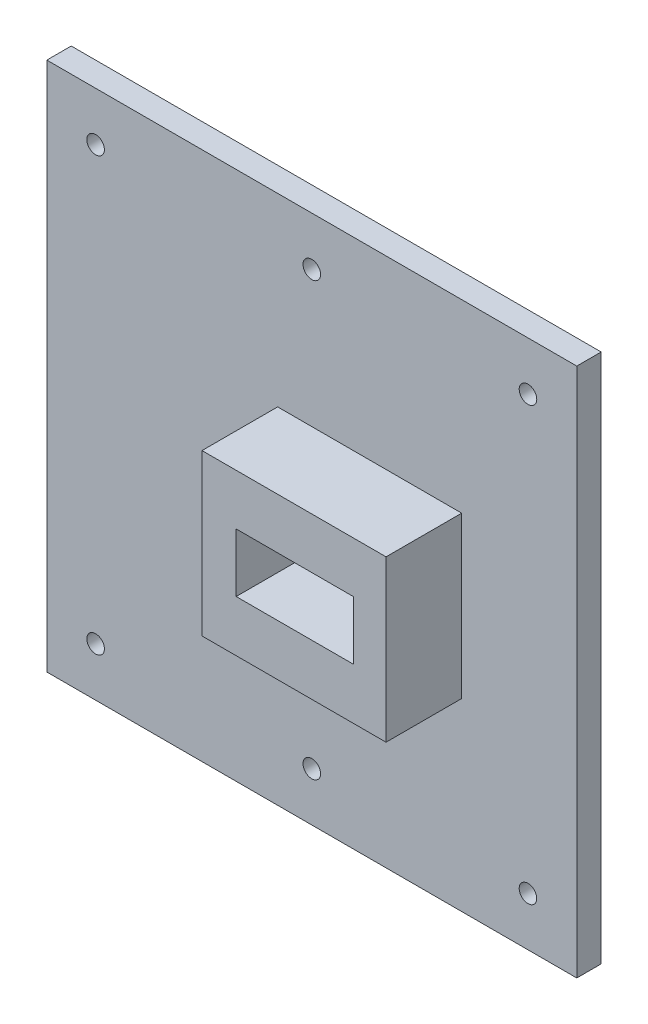
ISO-10303-21;
HEADER;
FILE_DESCRIPTION(('STEP AP214'),'2;1');
FILE_NAME('part.step','',(''),(''),'','','');
FILE_SCHEMA(('AUTOMOTIVE_DESIGN { 1 0 10303 214 1 1 1 1 }'));
ENDSEC;
DATA;
#1=APPLICATION_CONTEXT('core data for automotive mechanical design processes');
#2=APPLICATION_PROTOCOL_DEFINITION('international standard','automotive_design',2000,#1);
#3=PRODUCT_CONTEXT('',#1,'mechanical');
#4=PRODUCT('Part','Part','',(#3));
#5=PRODUCT_RELATED_PRODUCT_CATEGORY('part','',(#4));
#6=PRODUCT_DEFINITION_FORMATION('','',#4);
#7=PRODUCT_DEFINITION_CONTEXT('part definition',#1,'design');
#8=PRODUCT_DEFINITION('design','',#6,#7);
#9=PRODUCT_DEFINITION_SHAPE('','',#8);
#10=(LENGTH_UNIT() NAMED_UNIT(*) SI_UNIT(.MILLI.,.METRE.));
#11=(NAMED_UNIT(*) PLANE_ANGLE_UNIT() SI_UNIT($,.RADIAN.));
#12=(NAMED_UNIT(*) SI_UNIT($,.STERADIAN.) SOLID_ANGLE_UNIT());
#13=UNCERTAINTY_MEASURE_WITH_UNIT(LENGTH_MEASURE(1.E-05),#10,'distance_accuracy_value','');
#14=(GEOMETRIC_REPRESENTATION_CONTEXT(3) GLOBAL_UNCERTAINTY_ASSIGNED_CONTEXT((#13)) GLOBAL_UNIT_ASSIGNED_CONTEXT((#10,
#11,#12)) REPRESENTATION_CONTEXT('',''));
#15=CARTESIAN_POINT('',(0.,0.,0.));
#16=DIRECTION('',(0.,0.,1.));
#17=DIRECTION('',(1.,0.,0.));
#18=AXIS2_PLACEMENT_3D('',#15,#16,#17);
#19=CARTESIAN_POINT('',(0.,0.,5.));
#20=DIRECTION('',(0.,0.,1.));
#21=DIRECTION('',(1.,0.,0.));
#22=AXIS2_PLACEMENT_3D('',#19,#20,#21);
#23=PLANE('',#22);
#24=DIRECTION('',(0.,1.,0.));
#25=VECTOR('',#24,1.);
#26=CARTESIAN_POINT('',(11.7655451483791,0.,5.));
#27=LINE('',#26,#25);
#28=CARTESIAN_POINT('',(11.7655451483791,-131.477817804765,5.));
#29=VERTEX_POINT('',#28);
#30=CARTESIAN_POINT('',(11.7655451483791,-22.8878178047649,5.));
#31=VERTEX_POINT('',#30);
#32=EDGE_CURVE('E210',#29,#31,#27,.T.);
#33=ORIENTED_EDGE('',*,*,#32,.T.);
#34=DIRECTION('',(-1.,0.,0.));
#35=VECTOR('',#34,1.);
#36=CARTESIAN_POINT('',(0.,-22.8878178047649,5.));
#37=LINE('',#36,#35);
#38=CARTESIAN_POINT('',(-96.8244548516209,-22.8878178047649,5.));
#39=VERTEX_POINT('',#38);
#40=EDGE_CURVE('E213',#31,#39,#37,.T.);
#41=ORIENTED_EDGE('',*,*,#40,.T.);
#42=DIRECTION('',(0.,1.,0.));
#43=VECTOR('',#42,1.);
#44=CARTESIAN_POINT('',(-96.8244548516209,0.,5.));
#45=LINE('',#44,#43);
#46=CARTESIAN_POINT('',(-96.8244548516209,-131.477817804765,5.));
#47=VERTEX_POINT('',#46);
#48=EDGE_CURVE('E215',#47,#39,#45,.T.);
#49=ORIENTED_EDGE('',*,*,#48,.F.);
#50=DIRECTION('',(-1.,0.,0.));
#51=VECTOR('',#50,1.);
#52=CARTESIAN_POINT('',(0.,-131.477817804765,5.));
#53=LINE('',#52,#51);
#54=EDGE_CURVE('E218',#29,#47,#53,.T.);
#55=ORIENTED_EDGE('',*,*,#54,.F.);
#56=EDGE_LOOP('',(#33,#41,#49,#55));
#57=FACE_BOUND('',#56,.T.);
#58=CARTESIAN_POINT('',(1.76554514837908,-32.8878178047649,5.));
#59=DIRECTION('',(0.,0.,1.));
#60=DIRECTION('',(1.,0.,0.));
#61=AXIS2_PLACEMENT_3D('',#58,#59,#60);
#62=CIRCLE('',#61,1.8);
#63=CARTESIAN_POINT('',(3.56554514837908,-32.8878178047649,5.));
#64=VERTEX_POINT('',#63);
#65=EDGE_CURVE('E207',#64,#64,#62,.T.);
#66=ORIENTED_EDGE('',*,*,#65,.F.);
#67=EDGE_LOOP('',(#66));
#68=FACE_BOUND('',#67,.T.);
#69=CARTESIAN_POINT('',(1.76554514837908,-121.477817804765,5.));
#70=DIRECTION('',(0.,0.,1.));
#71=DIRECTION('',(1.,0.,0.));
#72=AXIS2_PLACEMENT_3D('',#69,#70,#71);
#73=CIRCLE('',#72,1.8);
#74=CARTESIAN_POINT('',(3.56554514837908,-121.477817804765,5.));
#75=VERTEX_POINT('',#74);
#76=EDGE_CURVE('E204',#75,#75,#73,.T.);
#77=ORIENTED_EDGE('',*,*,#76,.F.);
#78=EDGE_LOOP('',(#77));
#79=FACE_BOUND('',#78,.T.);
#80=CARTESIAN_POINT('',(-86.8244548516209,-121.477817804765,5.));
#81=DIRECTION('',(0.,0.,1.));
#82=DIRECTION('',(1.,0.,0.));
#83=AXIS2_PLACEMENT_3D('',#80,#81,#82);
#84=CIRCLE('',#83,1.79999999999999);
#85=CARTESIAN_POINT('',(-85.0244548516209,-121.477817804765,5.));
#86=VERTEX_POINT('',#85);
#87=EDGE_CURVE('E201',#86,#86,#84,.T.);
#88=ORIENTED_EDGE('',*,*,#87,.F.);
#89=EDGE_LOOP('',(#88));
#90=FACE_BOUND('',#89,.T.);
#91=CARTESIAN_POINT('',(-86.8244548516209,-32.8878178047649,5.));
#92=DIRECTION('',(0.,0.,1.));
#93=DIRECTION('',(1.,0.,0.));
#94=AXIS2_PLACEMENT_3D('',#91,#92,#93);
#95=CIRCLE('',#94,1.79999999999999);
#96=CARTESIAN_POINT('',(-85.0244548516209,-32.8878178047649,5.));
#97=VERTEX_POINT('',#96);
#98=EDGE_CURVE('E198',#97,#97,#95,.T.);
#99=ORIENTED_EDGE('',*,*,#98,.F.);
#100=EDGE_LOOP('',(#99));
#101=FACE_BOUND('',#100,.T.);
#102=CARTESIAN_POINT('',(-42.5294548516209,-32.8878178047649,5.));
#103=DIRECTION('',(0.,0.,1.));
#104=DIRECTION('',(1.,0.,0.));
#105=AXIS2_PLACEMENT_3D('',#102,#103,#104);
#106=CIRCLE('',#105,1.8);
#107=CARTESIAN_POINT('',(-40.7294548516209,-32.8878178047649,5.));
#108=VERTEX_POINT('',#107);
#109=EDGE_CURVE('E194',#108,#108,#106,.T.);
#110=ORIENTED_EDGE('',*,*,#109,.F.);
#111=EDGE_LOOP('',(#110));
#112=FACE_BOUND('',#111,.T.);
#113=CARTESIAN_POINT('',(-42.5294548516209,-121.477817804765,5.));
#114=DIRECTION('',(0.,0.,1.));
#115=DIRECTION('',(1.,0.,0.));
#116=AXIS2_PLACEMENT_3D('',#113,#114,#115);
#117=CIRCLE('',#116,1.8);
#118=CARTESIAN_POINT('',(-40.7294548516209,-121.477817804765,5.));
#119=VERTEX_POINT('',#118);
#120=EDGE_CURVE('E191',#119,#119,#117,.T.);
#121=ORIENTED_EDGE('',*,*,#120,.F.);
#122=EDGE_LOOP('',(#121));
#123=FACE_BOUND('',#122,.T.);
#124=DIRECTION('',(0.,1.,0.));
#125=VECTOR('',#124,1.);
#126=CARTESIAN_POINT('',(-11.8172544043155,-93.6790827296241,5.));
#127=LINE('',#126,#125);
#128=CARTESIAN_POINT('',(-11.8172544043155,-93.6790827296241,5.));
#129=VERTEX_POINT('',#128);
#130=CARTESIAN_POINT('',(-11.8172544043155,-60.7803795546279,5.));
#131=VERTEX_POINT('',#130);
#132=EDGE_CURVE('E177',#129,#131,#127,.T.);
#133=ORIENTED_EDGE('',*,*,#132,.F.);
#134=DIRECTION('',(1.,0.,0.));
#135=VECTOR('',#134,1.);
#136=CARTESIAN_POINT('',(-49.5294548516209,-93.6790827296241,5.));
#137=LINE('',#136,#135);
#138=CARTESIAN_POINT('',(-49.5294548516209,-93.6790827296241,5.));
#139=VERTEX_POINT('',#138);
#140=EDGE_CURVE('E142',#139,#129,#137,.T.);
#141=ORIENTED_EDGE('',*,*,#140,.F.);
#142=DIRECTION('',(0.,-1.,0.));
#143=VECTOR('',#142,1.);
#144=CARTESIAN_POINT('',(-49.5294548516209,-93.6790827296241,5.));
#145=LINE('',#144,#143);
#146=CARTESIAN_POINT('',(-49.5294548516209,-60.7803795546279,5.));
#147=VERTEX_POINT('',#146);
#148=EDGE_CURVE('E168',#147,#139,#145,.T.);
#149=ORIENTED_EDGE('',*,*,#148,.F.);
#150=DIRECTION('',(-1.,0.,0.));
#151=VECTOR('',#150,1.);
#152=CARTESIAN_POINT('',(-49.5294548516209,-60.7803795546279,5.));
#153=LINE('',#152,#151);
#154=EDGE_CURVE('E179',#131,#147,#153,.T.);
#155=ORIENTED_EDGE('',*,*,#154,.F.);
#156=EDGE_LOOP('',(#133,#141,#149,#155));
#157=FACE_BOUND('',#156,.T.);
#158=ADVANCED_FACE('F35',(#57,#68,#79,#90,#101,#112,#123,#157),#23,.T.);
#159=CARTESIAN_POINT('',(11.7655451483791,0.,5.));
#160=DIRECTION('',(-1.,0.,0.));
#161=DIRECTION('',(0.,0.,1.));
#162=AXIS2_PLACEMENT_3D('',#159,#160,#161);
#163=PLANE('',#162);
#164=DIRECTION('',(0.,1.,0.));
#165=VECTOR('',#164,1.);
#166=CARTESIAN_POINT('',(11.7655451483791,0.,0.));
#167=LINE('',#166,#165);
#168=CARTESIAN_POINT('',(11.7655451483791,-131.477817804765,0.));
#169=VERTEX_POINT('',#168);
#170=CARTESIAN_POINT('',(11.7655451483791,-22.8878178047649,0.));
#171=VERTEX_POINT('',#170);
#172=EDGE_CURVE('E239',#169,#171,#167,.T.);
#173=ORIENTED_EDGE('',*,*,#172,.T.);
#174=DIRECTION('',(0.,0.,-1.));
#175=VECTOR('',#174,1.);
#176=CARTESIAN_POINT('',(11.7655451483791,-22.8878178047649,5.));
#177=LINE('',#176,#175);
#178=EDGE_CURVE('E11',#31,#171,#177,.T.);
#179=ORIENTED_EDGE('',*,*,#178,.F.);
#180=ORIENTED_EDGE('',*,*,#32,.F.);
#181=DIRECTION('',(0.,0.,-1.));
#182=VECTOR('',#181,1.);
#183=CARTESIAN_POINT('',(11.7655451483791,-131.477817804765,5.));
#184=LINE('',#183,#182);
#185=EDGE_CURVE('E221',#29,#169,#184,.T.);
#186=ORIENTED_EDGE('',*,*,#185,.T.);
#187=EDGE_LOOP('',(#173,#179,#180,#186));
#188=FACE_BOUND('',#187,.T.);
#189=ADVANCED_FACE('F271',(#188),#163,.F.);
#190=CARTESIAN_POINT('',(0.,-22.8878178047649,5.));
#191=DIRECTION('',(0.,-1.,0.));
#192=DIRECTION('',(1.,0.,0.));
#193=AXIS2_PLACEMENT_3D('',#190,#191,#192);
#194=PLANE('',#193);
#195=DIRECTION('',(-1.,0.,0.));
#196=VECTOR('',#195,1.);
#197=CARTESIAN_POINT('',(0.,-22.8878178047649,0.));
#198=LINE('',#197,#196);
#199=CARTESIAN_POINT('',(-96.8244548516209,-22.8878178047649,0.));
#200=VERTEX_POINT('',#199);
#201=EDGE_CURVE('E242',#171,#200,#198,.T.);
#202=ORIENTED_EDGE('',*,*,#201,.T.);
#203=DIRECTION('',(0.,0.,-1.));
#204=VECTOR('',#203,1.);
#205=CARTESIAN_POINT('',(-96.8244548516209,-22.8878178047649,5.));
#206=LINE('',#205,#204);
#207=EDGE_CURVE('E43',#39,#200,#206,.T.);
#208=ORIENTED_EDGE('',*,*,#207,.F.);
#209=ORIENTED_EDGE('',*,*,#40,.F.);
#210=ORIENTED_EDGE('',*,*,#178,.T.);
#211=EDGE_LOOP('',(#202,#208,#209,#210));
#212=FACE_BOUND('',#211,.T.);
#213=ADVANCED_FACE('F258',(#212),#194,.F.);
#214=CARTESIAN_POINT('',(-96.8244548516209,0.,5.));
#215=DIRECTION('',(-1.,0.,0.));
#216=DIRECTION('',(0.,-1.,0.));
#217=AXIS2_PLACEMENT_3D('',#214,#215,#216);
#218=PLANE('',#217);
#219=DIRECTION('',(0.,1.,0.));
#220=VECTOR('',#219,1.);
#221=CARTESIAN_POINT('',(-96.8244548516209,0.,0.));
#222=LINE('',#221,#220);
#223=CARTESIAN_POINT('',(-96.8244548516209,-131.477817804765,0.));
#224=VERTEX_POINT('',#223);
#225=EDGE_CURVE('E245',#224,#200,#222,.T.);
#226=ORIENTED_EDGE('',*,*,#225,.F.);
#227=DIRECTION('',(0.,0.,-1.));
#228=VECTOR('',#227,1.);
#229=CARTESIAN_POINT('',(-96.8244548516209,-131.477817804765,5.));
#230=LINE('',#229,#228);
#231=EDGE_CURVE('E251',#47,#224,#230,.T.);
#232=ORIENTED_EDGE('',*,*,#231,.F.);
#233=ORIENTED_EDGE('',*,*,#48,.T.);
#234=ORIENTED_EDGE('',*,*,#207,.T.);
#235=EDGE_LOOP('',(#226,#232,#233,#234));
#236=FACE_BOUND('',#235,.T.);
#237=ADVANCED_FACE('F255',(#236),#218,.T.);
#238=CARTESIAN_POINT('',(1.76554514837908,-32.8878178047649,5.));
#239=DIRECTION('',(0.,0.,-1.));
#240=DIRECTION('',(-1.,0.,0.));
#241=AXIS2_PLACEMENT_3D('',#238,#239,#240);
#242=CYLINDRICAL_SURFACE('',#241,1.8);
#243=ORIENTED_EDGE('',*,*,#65,.T.);
#244=EDGE_LOOP('',(#243));
#245=FACE_BOUND('',#244,.T.);
#246=CARTESIAN_POINT('',(1.76554514837908,-32.8878178047649,0.));
#247=DIRECTION('',(0.,0.,1.));
#248=DIRECTION('',(1.,0.,0.));
#249=AXIS2_PLACEMENT_3D('',#246,#247,#248);
#250=CIRCLE('',#249,1.8);
#251=CARTESIAN_POINT('',(3.56554514837908,-32.8878178047649,0.));
#252=VERTEX_POINT('',#251);
#253=EDGE_CURVE('E236',#252,#252,#250,.T.);
#254=ORIENTED_EDGE('',*,*,#253,.F.);
#255=EDGE_LOOP('',(#254));
#256=FACE_BOUND('',#255,.T.);
#257=ADVANCED_FACE('F283',(#245,#256),#242,.F.);
#258=CARTESIAN_POINT('',(1.76554514837908,-121.477817804765,5.));
#259=DIRECTION('',(0.,0.,-1.));
#260=DIRECTION('',(-1.,0.,0.));
#261=AXIS2_PLACEMENT_3D('',#258,#259,#260);
#262=CYLINDRICAL_SURFACE('',#261,1.8);
#263=ORIENTED_EDGE('',*,*,#76,.T.);
#264=EDGE_LOOP('',(#263));
#265=FACE_BOUND('',#264,.T.);
#266=CARTESIAN_POINT('',(1.76554514837908,-121.477817804765,0.));
#267=DIRECTION('',(0.,0.,1.));
#268=DIRECTION('',(1.,0.,0.));
#269=AXIS2_PLACEMENT_3D('',#266,#267,#268);
#270=CIRCLE('',#269,1.8);
#271=CARTESIAN_POINT('',(3.56554514837908,-121.477817804765,0.));
#272=VERTEX_POINT('',#271);
#273=EDGE_CURVE('E233',#272,#272,#270,.T.);
#274=ORIENTED_EDGE('',*,*,#273,.F.);
#275=EDGE_LOOP('',(#274));
#276=FACE_BOUND('',#275,.T.);
#277=ADVANCED_FACE('F286',(#265,#276),#262,.F.);
#278=CARTESIAN_POINT('',(-86.8244548516209,-121.477817804765,5.));
#279=DIRECTION('',(0.,0.,-1.));
#280=DIRECTION('',(-1.,0.,0.));
#281=AXIS2_PLACEMENT_3D('',#278,#279,#280);
#282=CYLINDRICAL_SURFACE('',#281,1.79999999999999);
#283=ORIENTED_EDGE('',*,*,#87,.T.);
#284=EDGE_LOOP('',(#283));
#285=FACE_BOUND('',#284,.T.);
#286=CARTESIAN_POINT('',(-86.8244548516209,-121.477817804765,0.));
#287=DIRECTION('',(0.,0.,1.));
#288=DIRECTION('',(1.,0.,0.));
#289=AXIS2_PLACEMENT_3D('',#286,#287,#288);
#290=CIRCLE('',#289,1.79999999999999);
#291=CARTESIAN_POINT('',(-85.0244548516209,-121.477817804765,0.));
#292=VERTEX_POINT('',#291);
#293=EDGE_CURVE('E230',#292,#292,#290,.T.);
#294=ORIENTED_EDGE('',*,*,#293,.F.);
#295=EDGE_LOOP('',(#294));
#296=FACE_BOUND('',#295,.T.);
#297=ADVANCED_FACE('F290',(#285,#296),#282,.F.);
#298=CARTESIAN_POINT('',(-86.8244548516209,-32.8878178047649,5.));
#299=DIRECTION('',(0.,0.,-1.));
#300=DIRECTION('',(-1.,0.,0.));
#301=AXIS2_PLACEMENT_3D('',#298,#299,#300);
#302=CYLINDRICAL_SURFACE('',#301,1.79999999999999);
#303=ORIENTED_EDGE('',*,*,#98,.T.);
#304=EDGE_LOOP('',(#303));
#305=FACE_BOUND('',#304,.T.);
#306=CARTESIAN_POINT('',(-86.8244548516209,-32.8878178047649,0.));
#307=DIRECTION('',(0.,0.,1.));
#308=DIRECTION('',(1.,0.,0.));
#309=AXIS2_PLACEMENT_3D('',#306,#307,#308);
#310=CIRCLE('',#309,1.79999999999999);
#311=CARTESIAN_POINT('',(-85.0244548516209,-32.8878178047649,0.));
#312=VERTEX_POINT('',#311);
#313=EDGE_CURVE('E227',#312,#312,#310,.T.);
#314=ORIENTED_EDGE('',*,*,#313,.F.);
#315=EDGE_LOOP('',(#314));
#316=FACE_BOUND('',#315,.T.);
#317=ADVANCED_FACE('F294',(#305,#316),#302,.F.);
#318=CARTESIAN_POINT('',(-42.5294548516209,-32.8878178047649,5.));
#319=DIRECTION('',(0.,0.,-1.));
#320=DIRECTION('',(-1.,0.,0.));
#321=AXIS2_PLACEMENT_3D('',#318,#319,#320);
#322=CYLINDRICAL_SURFACE('',#321,1.8);
#323=ORIENTED_EDGE('',*,*,#109,.T.);
#324=EDGE_LOOP('',(#323));
#325=FACE_BOUND('',#324,.T.);
#326=CARTESIAN_POINT('',(-42.5294548516209,-32.8878178047649,0.));
#327=DIRECTION('',(0.,0.,1.));
#328=DIRECTION('',(1.,0.,0.));
#329=AXIS2_PLACEMENT_3D('',#326,#327,#328);
#330=CIRCLE('',#329,1.8);
#331=CARTESIAN_POINT('',(-40.7294548516209,-32.8878178047649,0.));
#332=VERTEX_POINT('',#331);
#333=EDGE_CURVE('E224',#332,#332,#330,.T.);
#334=ORIENTED_EDGE('',*,*,#333,.F.);
#335=EDGE_LOOP('',(#334));
#336=FACE_BOUND('',#335,.T.);
#337=ADVANCED_FACE('F297',(#325,#336),#322,.F.);
#338=CARTESIAN_POINT('',(-42.5294548516209,-121.477817804765,5.));
#339=DIRECTION('',(0.,0.,-1.));
#340=DIRECTION('',(-1.,0.,0.));
#341=AXIS2_PLACEMENT_3D('',#338,#339,#340);
#342=CYLINDRICAL_SURFACE('',#341,1.8);
#343=ORIENTED_EDGE('',*,*,#120,.T.);
#344=EDGE_LOOP('',(#343));
#345=FACE_BOUND('',#344,.T.);
#346=CARTESIAN_POINT('',(-42.5294548516209,-121.477817804765,0.));
#347=DIRECTION('',(0.,0.,1.));
#348=DIRECTION('',(1.,0.,0.));
#349=AXIS2_PLACEMENT_3D('',#346,#347,#348);
#350=CIRCLE('',#349,1.8);
#351=CARTESIAN_POINT('',(-40.7294548516209,-121.477817804765,0.));
#352=VERTEX_POINT('',#351);
#353=EDGE_CURVE('E190',#352,#352,#350,.T.);
#354=ORIENTED_EDGE('',*,*,#353,.F.);
#355=EDGE_LOOP('',(#354));
#356=FACE_BOUND('',#355,.T.);
#357=ADVANCED_FACE('F37',(#345,#356),#342,.F.);
#358=CARTESIAN_POINT('',(0.,-131.477817804765,5.));
#359=DIRECTION('',(0.,-1.,0.));
#360=DIRECTION('',(0.,0.,-1.));
#361=AXIS2_PLACEMENT_3D('',#358,#359,#360);
#362=PLANE('',#361);
#363=DIRECTION('',(-1.,0.,0.));
#364=VECTOR('',#363,1.);
#365=CARTESIAN_POINT('',(0.,-131.477817804765,0.));
#366=LINE('',#365,#364);
#367=EDGE_CURVE('E195',#169,#224,#366,.T.);
#368=ORIENTED_EDGE('',*,*,#367,.F.);
#369=ORIENTED_EDGE('',*,*,#185,.F.);
#370=ORIENTED_EDGE('',*,*,#54,.T.);
#371=ORIENTED_EDGE('',*,*,#231,.T.);
#372=EDGE_LOOP('',(#368,#369,#370,#371));
#373=FACE_BOUND('',#372,.T.);
#374=ADVANCED_FACE('F265',(#373),#362,.T.);
#375=CARTESIAN_POINT('',(0.,0.,0.));
#376=DIRECTION('',(0.,0.,1.));
#377=DIRECTION('',(1.,0.,0.));
#378=AXIS2_PLACEMENT_3D('',#375,#376,#377);
#379=PLANE('',#378);
#380=ORIENTED_EDGE('',*,*,#353,.T.);
#381=EDGE_LOOP('',(#380));
#382=FACE_BOUND('',#381,.T.);
#383=ORIENTED_EDGE('',*,*,#333,.T.);
#384=EDGE_LOOP('',(#383));
#385=FACE_BOUND('',#384,.T.);
#386=ORIENTED_EDGE('',*,*,#313,.T.);
#387=EDGE_LOOP('',(#386));
#388=FACE_BOUND('',#387,.T.);
#389=ORIENTED_EDGE('',*,*,#293,.T.);
#390=EDGE_LOOP('',(#389));
#391=FACE_BOUND('',#390,.T.);
#392=ORIENTED_EDGE('',*,*,#273,.T.);
#393=EDGE_LOOP('',(#392));
#394=FACE_BOUND('',#393,.T.);
#395=ORIENTED_EDGE('',*,*,#253,.T.);
#396=EDGE_LOOP('',(#395));
#397=FACE_BOUND('',#396,.T.);
#398=ORIENTED_EDGE('',*,*,#172,.F.);
#399=ORIENTED_EDGE('',*,*,#367,.T.);
#400=ORIENTED_EDGE('',*,*,#225,.T.);
#401=ORIENTED_EDGE('',*,*,#201,.F.);
#402=EDGE_LOOP('',(#398,#399,#400,#401));
#403=FACE_BOUND('',#402,.T.);
#404=ADVANCED_FACE('F262',(#382,#385,#388,#391,#394,#397,#403),#379,.F.);
#405=CARTESIAN_POINT('',(0.,0.,20.5));
#406=DIRECTION('',(0.,0.,1.));
#407=DIRECTION('',(1.,0.,0.));
#408=AXIS2_PLACEMENT_3D('',#405,#406,#407);
#409=PLANE('',#408);
#410=DIRECTION('',(1.,0.,0.));
#411=VECTOR('',#410,1.);
#412=CARTESIAN_POINT('',(-49.5294548516209,-93.6790827296241,20.5));
#413=LINE('',#412,#411);
#414=CARTESIAN_POINT('',(-49.5294548516209,-93.6790827296241,20.5));
#415=VERTEX_POINT('',#414);
#416=CARTESIAN_POINT('',(-11.8172544043155,-93.6790827296241,20.5));
#417=VERTEX_POINT('',#416);
#418=EDGE_CURVE('E164',#415,#417,#413,.T.);
#419=ORIENTED_EDGE('',*,*,#418,.T.);
#420=DIRECTION('',(0.,1.,0.));
#421=VECTOR('',#420,1.);
#422=CARTESIAN_POINT('',(-11.8172544043155,-93.6790827296241,20.5));
#423=LINE('',#422,#421);
#424=CARTESIAN_POINT('',(-11.8172544043155,-60.7803795546279,20.5));
#425=VERTEX_POINT('',#424);
#426=EDGE_CURVE('E167',#417,#425,#423,.T.);
#427=ORIENTED_EDGE('',*,*,#426,.T.);
#428=DIRECTION('',(-1.,0.,0.));
#429=VECTOR('',#428,1.);
#430=CARTESIAN_POINT('',(-49.5294548516209,-60.7803795546279,20.5));
#431=LINE('',#430,#429);
#432=CARTESIAN_POINT('',(-49.5294548516209,-60.7803795546279,20.5));
#433=VERTEX_POINT('',#432);
#434=EDGE_CURVE('E170',#425,#433,#431,.T.);
#435=ORIENTED_EDGE('',*,*,#434,.T.);
#436=DIRECTION('',(0.,-1.,0.));
#437=VECTOR('',#436,1.);
#438=CARTESIAN_POINT('',(-49.5294548516209,-93.6790827296241,20.5));
#439=LINE('',#438,#437);
#440=EDGE_CURVE('E172',#433,#415,#439,.T.);
#441=ORIENTED_EDGE('',*,*,#440,.T.);
#442=EDGE_LOOP('',(#419,#427,#435,#441));
#443=FACE_BOUND('',#442,.T.);
#444=DIRECTION('',(0.,1.,0.));
#445=VECTOR('',#444,1.);
#446=CARTESIAN_POINT('',(-18.5294548516209,-83.1828178047649,20.5));
#447=LINE('',#446,#445);
#448=CARTESIAN_POINT('',(-18.5294548516209,-83.1828178047649,20.5));
#449=VERTEX_POINT('',#448);
#450=CARTESIAN_POINT('',(-18.5294548516209,-71.1828178047649,20.5));
#451=VERTEX_POINT('',#450);
#452=EDGE_CURVE('E147',#449,#451,#447,.T.);
#453=ORIENTED_EDGE('',*,*,#452,.F.);
#454=DIRECTION('',(1.,0.,0.));
#455=VECTOR('',#454,1.);
#456=CARTESIAN_POINT('',(-42.5294548516209,-83.1828178047649,20.5));
#457=LINE('',#456,#455);
#458=CARTESIAN_POINT('',(-42.5294548516209,-83.1828178047649,20.5));
#459=VERTEX_POINT('',#458);
#460=EDGE_CURVE('E136',#459,#449,#457,.T.);
#461=ORIENTED_EDGE('',*,*,#460,.F.);
#462=DIRECTION('',(0.,-1.,0.));
#463=VECTOR('',#462,1.);
#464=CARTESIAN_POINT('',(-42.5294548516209,-77.1828178047649,20.5));
#465=LINE('',#464,#463);
#466=CARTESIAN_POINT('',(-42.5294548516209,-71.1828178047649,20.5));
#467=VERTEX_POINT('',#466);
#468=EDGE_CURVE('E125',#467,#459,#465,.T.);
#469=ORIENTED_EDGE('',*,*,#468,.F.);
#470=DIRECTION('',(-1.,0.,0.));
#471=VECTOR('',#470,1.);
#472=CARTESIAN_POINT('',(-42.5294548516209,-71.1828178047649,20.5));
#473=LINE('',#472,#471);
#474=EDGE_CURVE('E149',#451,#467,#473,.T.);
#475=ORIENTED_EDGE('',*,*,#474,.F.);
#476=EDGE_LOOP('',(#453,#461,#469,#475));
#477=FACE_BOUND('',#476,.T.);
#478=ADVANCED_FACE('F146',(#443,#477),#409,.T.);
#479=CARTESIAN_POINT('',(-49.5294548516209,-93.6790827296241,20.5));
#480=DIRECTION('',(0.,1.,0.));
#481=DIRECTION('',(0.,0.,1.));
#482=AXIS2_PLACEMENT_3D('',#479,#480,#481);
#483=PLANE('',#482);
#484=ORIENTED_EDGE('',*,*,#140,.T.);
#485=DIRECTION('',(0.,0.,-1.));
#486=VECTOR('',#485,1.);
#487=CARTESIAN_POINT('',(-11.8172544043155,-93.6790827296241,20.5));
#488=LINE('',#487,#486);
#489=EDGE_CURVE('E188',#417,#129,#488,.T.);
#490=ORIENTED_EDGE('',*,*,#489,.F.);
#491=ORIENTED_EDGE('',*,*,#418,.F.);
#492=DIRECTION('',(0.,0.,-1.));
#493=VECTOR('',#492,1.);
#494=CARTESIAN_POINT('',(-49.5294548516209,-93.6790827296241,20.5));
#495=LINE('',#494,#493);
#496=EDGE_CURVE('E174',#415,#139,#495,.T.);
#497=ORIENTED_EDGE('',*,*,#496,.T.);
#498=EDGE_LOOP('',(#484,#490,#491,#497));
#499=FACE_BOUND('',#498,.T.);
#500=ADVANCED_FACE('F328',(#499),#483,.F.);
#501=CARTESIAN_POINT('',(-11.8172544043155,-93.6790827296241,20.5));
#502=DIRECTION('',(-1.,0.,0.));
#503=DIRECTION('',(0.,0.,1.));
#504=AXIS2_PLACEMENT_3D('',#501,#502,#503);
#505=PLANE('',#504);
#506=ORIENTED_EDGE('',*,*,#132,.T.);
#507=DIRECTION('',(0.,0.,-1.));
#508=VECTOR('',#507,1.);
#509=CARTESIAN_POINT('',(-11.8172544043155,-60.7803795546279,20.5));
#510=LINE('',#509,#508);
#511=EDGE_CURVE('E185',#425,#131,#510,.T.);
#512=ORIENTED_EDGE('',*,*,#511,.F.);
#513=ORIENTED_EDGE('',*,*,#426,.F.);
#514=ORIENTED_EDGE('',*,*,#489,.T.);
#515=EDGE_LOOP('',(#506,#512,#513,#514));
#516=FACE_BOUND('',#515,.T.);
#517=ADVANCED_FACE('F396',(#516),#505,.F.);
#518=CARTESIAN_POINT('',(-49.5294548516209,-60.7803795546279,20.5));
#519=DIRECTION('',(0.,-1.,0.));
#520=DIRECTION('',(1.,0.,0.));
#521=AXIS2_PLACEMENT_3D('',#518,#519,#520);
#522=PLANE('',#521);
#523=ORIENTED_EDGE('',*,*,#154,.T.);
#524=DIRECTION('',(0.,0.,-1.));
#525=VECTOR('',#524,1.);
#526=CARTESIAN_POINT('',(-49.5294548516209,-60.7803795546279,20.5));
#527=LINE('',#526,#525);
#528=EDGE_CURVE('E50',#433,#147,#527,.T.);
#529=ORIENTED_EDGE('',*,*,#528,.F.);
#530=ORIENTED_EDGE('',*,*,#434,.F.);
#531=ORIENTED_EDGE('',*,*,#511,.T.);
#532=EDGE_LOOP('',(#523,#529,#530,#531));
#533=FACE_BOUND('',#532,.T.);
#534=ADVANCED_FACE('F405',(#533),#522,.F.);
#535=CARTESIAN_POINT('',(-49.5294548516209,-93.6790827296241,20.5));
#536=DIRECTION('',(1.,0.,0.));
#537=DIRECTION('',(0.,0.,-1.));
#538=AXIS2_PLACEMENT_3D('',#535,#536,#537);
#539=PLANE('',#538);
#540=ORIENTED_EDGE('',*,*,#148,.T.);
#541=ORIENTED_EDGE('',*,*,#496,.F.);
#542=ORIENTED_EDGE('',*,*,#440,.F.);
#543=ORIENTED_EDGE('',*,*,#528,.T.);
#544=EDGE_LOOP('',(#540,#541,#542,#543));
#545=FACE_BOUND('',#544,.T.);
#546=ADVANCED_FACE('F415',(#545),#539,.F.);
#547=CARTESIAN_POINT('',(-42.5294548516209,-83.1828178047649,20.5));
#548=DIRECTION('',(0.,1.,0.));
#549=DIRECTION('',(0.,0.,1.));
#550=AXIS2_PLACEMENT_3D('',#547,#548,#549);
#551=PLANE('',#550);
#552=DIRECTION('',(1.,0.,0.));
#553=VECTOR('',#552,1.);
#554=CARTESIAN_POINT('',(-42.5294548516209,-83.1828178047649,5.));
#555=LINE('',#554,#553);
#556=CARTESIAN_POINT('',(-42.5294548516209,-83.1828178047649,5.));
#557=VERTEX_POINT('',#556);
#558=CARTESIAN_POINT('',(-18.5294548516209,-83.1828178047649,5.));
#559=VERTEX_POINT('',#558);
#560=EDGE_CURVE('E58',#557,#559,#555,.T.);
#561=ORIENTED_EDGE('',*,*,#560,.F.);
#562=DIRECTION('',(0.,0.,-1.));
#563=VECTOR('',#562,1.);
#564=CARTESIAN_POINT('',(-42.5294548516209,-83.1828178047649,20.5));
#565=LINE('',#564,#563);
#566=EDGE_CURVE('E129',#459,#557,#565,.T.);
#567=ORIENTED_EDGE('',*,*,#566,.F.);
#568=ORIENTED_EDGE('',*,*,#460,.T.);
#569=DIRECTION('',(0.,0.,-1.));
#570=VECTOR('',#569,1.);
#571=CARTESIAN_POINT('',(-18.5294548516209,-83.1828178047649,20.5));
#572=LINE('',#571,#570);
#573=EDGE_CURVE('E143',#449,#559,#572,.T.);
#574=ORIENTED_EDGE('',*,*,#573,.T.);
#575=EDGE_LOOP('',(#561,#567,#568,#574));
#576=FACE_BOUND('',#575,.T.);
#577=ADVANCED_FACE('F140',(#576),#551,.T.);
#578=CARTESIAN_POINT('',(-18.5294548516209,-83.1828178047649,20.5));
#579=DIRECTION('',(-1.,0.,0.));
#580=DIRECTION('',(0.,0.,1.));
#581=AXIS2_PLACEMENT_3D('',#578,#579,#580);
#582=PLANE('',#581);
#583=DIRECTION('',(0.,1.,0.));
#584=VECTOR('',#583,1.);
#585=CARTESIAN_POINT('',(-18.5294548516209,-83.1828178047649,5.));
#586=LINE('',#585,#584);
#587=CARTESIAN_POINT('',(-18.5294548516209,-71.1828178047649,5.));
#588=VERTEX_POINT('',#587);
#589=EDGE_CURVE('E154',#559,#588,#586,.T.);
#590=ORIENTED_EDGE('',*,*,#589,.F.);
#591=ORIENTED_EDGE('',*,*,#573,.F.);
#592=ORIENTED_EDGE('',*,*,#452,.T.);
#593=DIRECTION('',(0.,0.,-1.));
#594=VECTOR('',#593,1.);
#595=CARTESIAN_POINT('',(-18.5294548516209,-71.1828178047649,20.5));
#596=LINE('',#595,#594);
#597=EDGE_CURVE('E160',#451,#588,#596,.T.);
#598=ORIENTED_EDGE('',*,*,#597,.T.);
#599=EDGE_LOOP('',(#590,#591,#592,#598));
#600=FACE_BOUND('',#599,.T.);
#601=ADVANCED_FACE('F433',(#600),#582,.T.);
#602=CARTESIAN_POINT('',(-42.5294548516209,-71.1828178047649,20.5));
#603=DIRECTION('',(0.,-1.,0.));
#604=DIRECTION('',(0.,0.,-1.));
#605=AXIS2_PLACEMENT_3D('',#602,#603,#604);
#606=PLANE('',#605);
#607=DIRECTION('',(-1.,0.,0.));
#608=VECTOR('',#607,1.);
#609=CARTESIAN_POINT('',(-42.5294548516209,-71.1828178047649,5.));
#610=LINE('',#609,#608);
#611=CARTESIAN_POINT('',(-42.5294548516209,-71.1828178047649,5.));
#612=VERTEX_POINT('',#611);
#613=EDGE_CURVE('E156',#588,#612,#610,.T.);
#614=ORIENTED_EDGE('',*,*,#613,.F.);
#615=ORIENTED_EDGE('',*,*,#597,.F.);
#616=ORIENTED_EDGE('',*,*,#474,.T.);
#617=DIRECTION('',(0.,0.,-1.));
#618=VECTOR('',#617,1.);
#619=CARTESIAN_POINT('',(-42.5294548516209,-71.1828178047649,20.5));
#620=LINE('',#619,#618);
#621=EDGE_CURVE('E131',#467,#612,#620,.T.);
#622=ORIENTED_EDGE('',*,*,#621,.T.);
#623=EDGE_LOOP('',(#614,#615,#616,#622));
#624=FACE_BOUND('',#623,.T.);
#625=ADVANCED_FACE('F442',(#624),#606,.T.);
#626=CARTESIAN_POINT('',(-42.5294548516209,-77.1828178047649,20.5));
#627=DIRECTION('',(1.,0.,0.));
#628=DIRECTION('',(0.,1.,0.));
#629=AXIS2_PLACEMENT_3D('',#626,#627,#628);
#630=PLANE('',#629);
#631=DIRECTION('',(0.,-1.,0.));
#632=VECTOR('',#631,1.);
#633=CARTESIAN_POINT('',(-42.5294548516209,-77.1828178047649,5.));
#634=LINE('',#633,#632);
#635=EDGE_CURVE('E137',#612,#557,#634,.T.);
#636=ORIENTED_EDGE('',*,*,#635,.F.);
#637=ORIENTED_EDGE('',*,*,#621,.F.);
#638=ORIENTED_EDGE('',*,*,#468,.T.);
#639=ORIENTED_EDGE('',*,*,#566,.T.);
#640=EDGE_LOOP('',(#636,#637,#638,#639));
#641=FACE_BOUND('',#640,.T.);
#642=ADVANCED_FACE('F128',(#641),#630,.T.);
#643=ORIENTED_EDGE('',*,*,#560,.T.);
#644=ORIENTED_EDGE('',*,*,#589,.T.);
#645=ORIENTED_EDGE('',*,*,#613,.T.);
#646=ORIENTED_EDGE('',*,*,#635,.T.);
#647=EDGE_LOOP('',(#643,#644,#645,#646));
#648=FACE_BOUND('',#647,.T.);
#649=ADVANCED_FACE('F280',(#648),#23,.T.);
#650=CLOSED_SHELL('',(#158,#189,#213,#237,#257,#277,#297,#317,#337,#357,#374,#404,#478,#500,
#517,#534,#546,#577,#601,#625,#642,#649));
#651=MANIFOLD_SOLID_BREP('B2',#650);
#652=ADVANCED_BREP_SHAPE_REPRESENTATION('',(#18,#651),#14);
#653=SHAPE_DEFINITION_REPRESENTATION(#9,#652);
ENDSEC;
END-ISO-10303-21;
